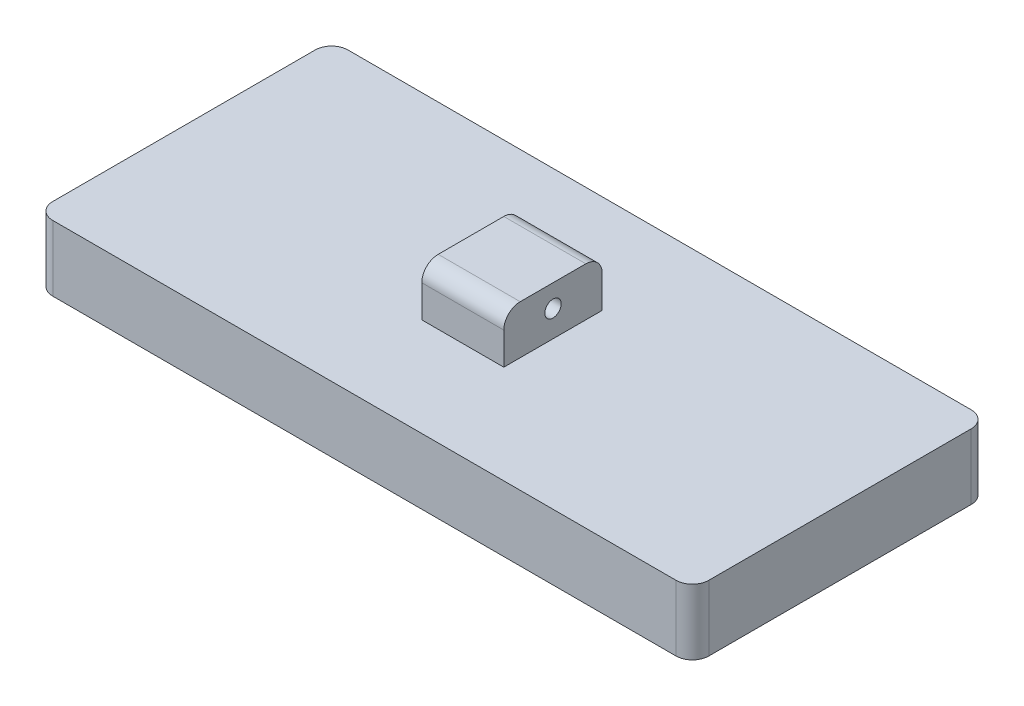
ISO-10303-21;
HEADER;
FILE_DESCRIPTION(('STEP AP214'),'2;1');
FILE_NAME('part.step','',(''),(''),'','','');
FILE_SCHEMA(('AUTOMOTIVE_DESIGN { 1 0 10303 214 1 1 1 1 }'));
ENDSEC;
DATA;
#1=APPLICATION_CONTEXT('core data for automotive mechanical design processes');
#2=APPLICATION_PROTOCOL_DEFINITION('international standard','automotive_design',2000,#1);
#3=PRODUCT_CONTEXT('',#1,'mechanical');
#4=PRODUCT('Part','Part','',(#3));
#5=PRODUCT_RELATED_PRODUCT_CATEGORY('part','',(#4));
#6=PRODUCT_DEFINITION_FORMATION('','',#4);
#7=PRODUCT_DEFINITION_CONTEXT('part definition',#1,'design');
#8=PRODUCT_DEFINITION('design','',#6,#7);
#9=PRODUCT_DEFINITION_SHAPE('','',#8);
#10=(LENGTH_UNIT() NAMED_UNIT(*) SI_UNIT(.MILLI.,.METRE.));
#11=(NAMED_UNIT(*) PLANE_ANGLE_UNIT() SI_UNIT($,.RADIAN.));
#12=(NAMED_UNIT(*) SI_UNIT($,.STERADIAN.) SOLID_ANGLE_UNIT());
#13=UNCERTAINTY_MEASURE_WITH_UNIT(LENGTH_MEASURE(1.E-05),#10,'distance_accuracy_value','');
#14=(GEOMETRIC_REPRESENTATION_CONTEXT(3) GLOBAL_UNCERTAINTY_ASSIGNED_CONTEXT((#13)) GLOBAL_UNIT_ASSIGNED_CONTEXT((#10,
#11,#12)) REPRESENTATION_CONTEXT('',''));
#15=CARTESIAN_POINT('',(0.,0.,0.));
#16=DIRECTION('',(0.,0.,1.));
#17=DIRECTION('',(1.,0.,0.));
#18=AXIS2_PLACEMENT_3D('',#15,#16,#17);
#19=CARTESIAN_POINT('',(0.,20.,0.));
#20=DIRECTION('',(0.,-1.,0.));
#21=DIRECTION('',(0.,0.,-1.));
#22=AXIS2_PLACEMENT_3D('',#19,#20,#21);
#23=PLANE('',#22);
#24=DIRECTION('',(1.,0.,0.));
#25=VECTOR('',#24,1.);
#26=CARTESIAN_POINT('',(0.,20.,0.));
#27=LINE('',#26,#25);
#28=CARTESIAN_POINT('',(5.,20.,0.));
#29=VERTEX_POINT('',#28);
#30=CARTESIAN_POINT('',(195.,20.,0.));
#31=VERTEX_POINT('',#30);
#32=EDGE_CURVE('E292',#29,#31,#27,.T.);
#33=ORIENTED_EDGE('',*,*,#32,.T.);
#34=CARTESIAN_POINT('',(195.,20.,-5.));
#35=DIRECTION('',(0.,-1.,0.));
#36=DIRECTION('',(0.,0.,-1.));
#37=AXIS2_PLACEMENT_3D('',#34,#35,#36);
#38=CIRCLE('',#37,5.);
#39=CARTESIAN_POINT('',(200.,20.,-5.));
#40=VERTEX_POINT('',#39);
#41=EDGE_CURVE('E354',#31,#40,#38,.F.);
#42=ORIENTED_EDGE('',*,*,#41,.T.);
#43=DIRECTION('',(0.,0.,-1.));
#44=VECTOR('',#43,1.);
#45=CARTESIAN_POINT('',(200.,20.,0.));
#46=LINE('',#45,#44);
#47=CARTESIAN_POINT('',(200.,20.,-85.));
#48=VERTEX_POINT('',#47);
#49=EDGE_CURVE('E297',#40,#48,#46,.T.);
#50=ORIENTED_EDGE('',*,*,#49,.T.);
#51=CARTESIAN_POINT('',(195.,20.,-85.));
#52=DIRECTION('',(0.,-1.,0.));
#53=DIRECTION('',(0.,0.,-1.));
#54=AXIS2_PLACEMENT_3D('',#51,#52,#53);
#55=CIRCLE('',#54,5.);
#56=CARTESIAN_POINT('',(195.,20.,-90.));
#57=VERTEX_POINT('',#56);
#58=EDGE_CURVE('E351',#48,#57,#55,.F.);
#59=ORIENTED_EDGE('',*,*,#58,.T.);
#60=DIRECTION('',(-1.,0.,0.));
#61=VECTOR('',#60,1.);
#62=CARTESIAN_POINT('',(0.,20.,-90.));
#63=LINE('',#62,#61);
#64=CARTESIAN_POINT('',(5.,20.,-90.));
#65=VERTEX_POINT('',#64);
#66=EDGE_CURVE('E301',#57,#65,#63,.T.);
#67=ORIENTED_EDGE('',*,*,#66,.T.);
#68=CARTESIAN_POINT('',(5.,20.,-85.));
#69=DIRECTION('',(0.,-1.,0.));
#70=DIRECTION('',(0.,0.,-1.));
#71=AXIS2_PLACEMENT_3D('',#68,#69,#70);
#72=CIRCLE('',#71,5.);
#73=CARTESIAN_POINT('',(0.,20.,-85.));
#74=VERTEX_POINT('',#73);
#75=EDGE_CURVE('E348',#65,#74,#72,.F.);
#76=ORIENTED_EDGE('',*,*,#75,.T.);
#77=DIRECTION('',(0.,0.,1.));
#78=VECTOR('',#77,1.);
#79=CARTESIAN_POINT('',(0.,20.,0.));
#80=LINE('',#79,#78);
#81=CARTESIAN_POINT('',(0.,20.,-5.));
#82=VERTEX_POINT('',#81);
#83=EDGE_CURVE('E288',#74,#82,#80,.T.);
#84=ORIENTED_EDGE('',*,*,#83,.T.);
#85=CARTESIAN_POINT('',(5.,20.,-5.));
#86=DIRECTION('',(0.,-1.,0.));
#87=DIRECTION('',(0.,0.,-1.));
#88=AXIS2_PLACEMENT_3D('',#85,#86,#87);
#89=CIRCLE('',#88,5.);
#90=EDGE_CURVE('E345',#82,#29,#89,.F.);
#91=ORIENTED_EDGE('',*,*,#90,.T.);
#92=EDGE_LOOP('',(#33,#42,#50,#59,#67,#76,#84,#91));
#93=FACE_BOUND('',#92,.T.);
#94=DIRECTION('',(0.,0.,1.));
#95=VECTOR('',#94,1.);
#96=CARTESIAN_POINT('',(87.5,20.,-30.));
#97=LINE('',#96,#95);
#98=CARTESIAN_POINT('',(87.5,20.,-60.));
#99=VERTEX_POINT('',#98);
#100=CARTESIAN_POINT('',(87.5,20.,-30.));
#101=VERTEX_POINT('',#100);
#102=EDGE_CURVE('E240',#99,#101,#97,.T.);
#103=ORIENTED_EDGE('',*,*,#102,.F.);
#104=DIRECTION('',(-1.,0.,0.));
#105=VECTOR('',#104,1.);
#106=CARTESIAN_POINT('',(87.5,20.,-60.));
#107=LINE('',#106,#105);
#108=CARTESIAN_POINT('',(112.5,20.,-60.));
#109=VERTEX_POINT('',#108);
#110=EDGE_CURVE('E257',#109,#99,#107,.T.);
#111=ORIENTED_EDGE('',*,*,#110,.F.);
#112=DIRECTION('',(0.,0.,-1.));
#113=VECTOR('',#112,1.);
#114=CARTESIAN_POINT('',(112.5,20.,-30.));
#115=LINE('',#114,#113);
#116=CARTESIAN_POINT('',(112.5,20.,-30.));
#117=VERTEX_POINT('',#116);
#118=EDGE_CURVE('E269',#117,#109,#115,.T.);
#119=ORIENTED_EDGE('',*,*,#118,.F.);
#120=DIRECTION('',(1.,0.,0.));
#121=VECTOR('',#120,1.);
#122=CARTESIAN_POINT('',(87.5,20.,-30.));
#123=LINE('',#122,#121);
#124=EDGE_CURVE('E265',#101,#117,#123,.T.);
#125=ORIENTED_EDGE('',*,*,#124,.F.);
#126=EDGE_LOOP('',(#103,#111,#119,#125));
#127=FACE_BOUND('',#126,.T.);
#128=ADVANCED_FACE('F39',(#93,#127),#23,.F.);
#129=CARTESIAN_POINT('',(0.,20.,0.));
#130=DIRECTION('',(1.,0.,0.));
#131=DIRECTION('',(0.,0.,-1.));
#132=AXIS2_PLACEMENT_3D('',#129,#130,#131);
#133=PLANE('',#132);
#134=ORIENTED_EDGE('',*,*,#83,.F.);
#135=DIRECTION('',(0.,-1.,0.));
#136=VECTOR('',#135,1.);
#137=CARTESIAN_POINT('',(0.,20.,-85.));
#138=LINE('',#137,#136);
#139=CARTESIAN_POINT('',(0.,0.,-85.));
#140=VERTEX_POINT('',#139);
#141=EDGE_CURVE('E367',#74,#140,#138,.T.);
#142=ORIENTED_EDGE('',*,*,#141,.T.);
#143=DIRECTION('',(0.,0.,1.));
#144=VECTOR('',#143,1.);
#145=CARTESIAN_POINT('',(0.,0.,0.));
#146=LINE('',#145,#144);
#147=CARTESIAN_POINT('',(0.,0.,-5.));
#148=VERTEX_POINT('',#147);
#149=EDGE_CURVE('E287',#140,#148,#146,.T.);
#150=ORIENTED_EDGE('',*,*,#149,.T.);
#151=DIRECTION('',(0.,-1.,0.));
#152=VECTOR('',#151,1.);
#153=CARTESIAN_POINT('',(0.,20.,-5.));
#154=LINE('',#153,#152);
#155=EDGE_CURVE('E364',#148,#82,#154,.F.);
#156=ORIENTED_EDGE('',*,*,#155,.T.);
#157=EDGE_LOOP('',(#134,#142,#150,#156));
#158=FACE_BOUND('',#157,.T.);
#159=ADVANCED_FACE('F425',(#158),#133,.F.);
#160=CARTESIAN_POINT('',(0.,20.,0.));
#161=DIRECTION('',(0.,0.,-1.));
#162=DIRECTION('',(-1.,0.,0.));
#163=AXIS2_PLACEMENT_3D('',#160,#161,#162);
#164=PLANE('',#163);
#165=DIRECTION('',(1.,0.,0.));
#166=VECTOR('',#165,1.);
#167=CARTESIAN_POINT('',(0.,0.,0.));
#168=LINE('',#167,#166);
#169=CARTESIAN_POINT('',(5.,0.,0.));
#170=VERTEX_POINT('',#169);
#171=CARTESIAN_POINT('',(195.,0.,0.));
#172=VERTEX_POINT('',#171);
#173=EDGE_CURVE('E309',#170,#172,#168,.T.);
#174=ORIENTED_EDGE('',*,*,#173,.T.);
#175=DIRECTION('',(0.,-1.,0.));
#176=VECTOR('',#175,1.);
#177=CARTESIAN_POINT('',(195.,20.,0.));
#178=LINE('',#177,#176);
#179=EDGE_CURVE('E342',#172,#31,#178,.F.);
#180=ORIENTED_EDGE('',*,*,#179,.T.);
#181=ORIENTED_EDGE('',*,*,#32,.F.);
#182=DIRECTION('',(0.,-1.,0.));
#183=VECTOR('',#182,1.);
#184=CARTESIAN_POINT('',(5.,20.,0.));
#185=LINE('',#184,#183);
#186=EDGE_CURVE('E338',#29,#170,#185,.T.);
#187=ORIENTED_EDGE('',*,*,#186,.T.);
#188=EDGE_LOOP('',(#174,#180,#181,#187));
#189=FACE_BOUND('',#188,.T.);
#190=ADVANCED_FACE('F431',(#189),#164,.F.);
#191=CARTESIAN_POINT('',(200.,20.,0.));
#192=DIRECTION('',(-1.,0.,0.));
#193=DIRECTION('',(0.,0.,1.));
#194=AXIS2_PLACEMENT_3D('',#191,#192,#193);
#195=PLANE('',#194);
#196=ORIENTED_EDGE('',*,*,#49,.F.);
#197=DIRECTION('',(0.,-1.,0.));
#198=VECTOR('',#197,1.);
#199=CARTESIAN_POINT('',(200.,20.,-5.));
#200=LINE('',#199,#198);
#201=CARTESIAN_POINT('',(200.,0.,-5.));
#202=VERTEX_POINT('',#201);
#203=EDGE_CURVE('E322',#40,#202,#200,.T.);
#204=ORIENTED_EDGE('',*,*,#203,.T.);
#205=DIRECTION('',(0.,0.,-1.));
#206=VECTOR('',#205,1.);
#207=CARTESIAN_POINT('',(200.,0.,0.));
#208=LINE('',#207,#206);
#209=CARTESIAN_POINT('',(200.,0.,-85.));
#210=VERTEX_POINT('',#209);
#211=EDGE_CURVE('E313',#202,#210,#208,.T.);
#212=ORIENTED_EDGE('',*,*,#211,.T.);
#213=DIRECTION('',(0.,-1.,0.));
#214=VECTOR('',#213,1.);
#215=CARTESIAN_POINT('',(200.,20.,-85.));
#216=LINE('',#215,#214);
#217=EDGE_CURVE('E305',#210,#48,#216,.F.);
#218=ORIENTED_EDGE('',*,*,#217,.T.);
#219=EDGE_LOOP('',(#196,#204,#212,#218));
#220=FACE_BOUND('',#219,.T.);
#221=ADVANCED_FACE('F445',(#220),#195,.F.);
#222=CARTESIAN_POINT('',(0.,20.,-90.));
#223=DIRECTION('',(0.,0.,1.));
#224=DIRECTION('',(1.,0.,0.));
#225=AXIS2_PLACEMENT_3D('',#222,#223,#224);
#226=PLANE('',#225);
#227=ORIENTED_EDGE('',*,*,#66,.F.);
#228=DIRECTION('',(0.,-1.,0.));
#229=VECTOR('',#228,1.);
#230=CARTESIAN_POINT('',(195.,20.,-90.));
#231=LINE('',#230,#229);
#232=CARTESIAN_POINT('',(195.,0.,-90.));
#233=VERTEX_POINT('',#232);
#234=EDGE_CURVE('E360',#57,#233,#231,.T.);
#235=ORIENTED_EDGE('',*,*,#234,.T.);
#236=DIRECTION('',(-1.,0.,0.));
#237=VECTOR('',#236,1.);
#238=CARTESIAN_POINT('',(0.,0.,-90.));
#239=LINE('',#238,#237);
#240=CARTESIAN_POINT('',(5.,0.,-90.));
#241=VERTEX_POINT('',#240);
#242=EDGE_CURVE('E293',#233,#241,#239,.T.);
#243=ORIENTED_EDGE('',*,*,#242,.T.);
#244=DIRECTION('',(0.,-1.,0.));
#245=VECTOR('',#244,1.);
#246=CARTESIAN_POINT('',(5.,20.,-90.));
#247=LINE('',#246,#245);
#248=EDGE_CURVE('E357',#241,#65,#247,.F.);
#249=ORIENTED_EDGE('',*,*,#248,.T.);
#250=EDGE_LOOP('',(#227,#235,#243,#249));
#251=FACE_BOUND('',#250,.T.);
#252=ADVANCED_FACE('F441',(#251),#226,.F.);
#253=CARTESIAN_POINT('',(0.,0.,0.));
#254=DIRECTION('',(0.,-1.,0.));
#255=DIRECTION('',(0.,0.,-1.));
#256=AXIS2_PLACEMENT_3D('',#253,#254,#255);
#257=PLANE('',#256);
#258=ORIENTED_EDGE('',*,*,#211,.F.);
#259=CARTESIAN_POINT('',(195.,0.,-5.));
#260=DIRECTION('',(0.,-1.,0.));
#261=DIRECTION('',(0.,0.,-1.));
#262=AXIS2_PLACEMENT_3D('',#259,#260,#261);
#263=CIRCLE('',#262,5.);
#264=EDGE_CURVE('E335',#202,#172,#263,.T.);
#265=ORIENTED_EDGE('',*,*,#264,.T.);
#266=ORIENTED_EDGE('',*,*,#173,.F.);
#267=CARTESIAN_POINT('',(5.,0.,-5.));
#268=DIRECTION('',(0.,-1.,0.));
#269=DIRECTION('',(0.,0.,-1.));
#270=AXIS2_PLACEMENT_3D('',#267,#268,#269);
#271=CIRCLE('',#270,5.);
#272=EDGE_CURVE('E326',#170,#148,#271,.T.);
#273=ORIENTED_EDGE('',*,*,#272,.T.);
#274=ORIENTED_EDGE('',*,*,#149,.F.);
#275=CARTESIAN_POINT('',(5.,0.,-85.));
#276=DIRECTION('',(0.,-1.,0.));
#277=DIRECTION('',(0.,0.,-1.));
#278=AXIS2_PLACEMENT_3D('',#275,#276,#277);
#279=CIRCLE('',#278,5.);
#280=EDGE_CURVE('E329',#140,#241,#279,.T.);
#281=ORIENTED_EDGE('',*,*,#280,.T.);
#282=ORIENTED_EDGE('',*,*,#242,.F.);
#283=CARTESIAN_POINT('',(195.,0.,-85.));
#284=DIRECTION('',(0.,-1.,0.));
#285=DIRECTION('',(0.,0.,-1.));
#286=AXIS2_PLACEMENT_3D('',#283,#284,#285);
#287=CIRCLE('',#286,5.);
#288=EDGE_CURVE('E332',#233,#210,#287,.T.);
#289=ORIENTED_EDGE('',*,*,#288,.T.);
#290=EDGE_LOOP('',(#258,#265,#266,#273,#274,#281,#282,#289));
#291=FACE_BOUND('',#290,.T.);
#292=ADVANCED_FACE('F437',(#291),#257,.T.);
#293=CARTESIAN_POINT('',(195.,20.,-5.));
#294=DIRECTION('',(0.,-1.,0.));
#295=DIRECTION('',(0.,0.,-1.));
#296=AXIS2_PLACEMENT_3D('',#293,#294,#295);
#297=CYLINDRICAL_SURFACE('',#296,5.);
#298=ORIENTED_EDGE('',*,*,#41,.F.);
#299=ORIENTED_EDGE('',*,*,#179,.F.);
#300=ORIENTED_EDGE('',*,*,#264,.F.);
#301=ORIENTED_EDGE('',*,*,#203,.F.);
#302=EDGE_LOOP('',(#298,#299,#300,#301));
#303=FACE_BOUND('',#302,.T.);
#304=ADVANCED_FACE('F440',(#303),#297,.T.);
#305=CARTESIAN_POINT('',(195.,20.,-85.));
#306=DIRECTION('',(0.,-1.,0.));
#307=DIRECTION('',(0.,0.,-1.));
#308=AXIS2_PLACEMENT_3D('',#305,#306,#307);
#309=CYLINDRICAL_SURFACE('',#308,5.);
#310=ORIENTED_EDGE('',*,*,#58,.F.);
#311=ORIENTED_EDGE('',*,*,#217,.F.);
#312=ORIENTED_EDGE('',*,*,#288,.F.);
#313=ORIENTED_EDGE('',*,*,#234,.F.);
#314=EDGE_LOOP('',(#310,#311,#312,#313));
#315=FACE_BOUND('',#314,.T.);
#316=ADVANCED_FACE('F455',(#315),#309,.T.);
#317=CARTESIAN_POINT('',(5.,20.,-85.));
#318=DIRECTION('',(0.,-1.,0.));
#319=DIRECTION('',(0.,0.,-1.));
#320=AXIS2_PLACEMENT_3D('',#317,#318,#319);
#321=CYLINDRICAL_SURFACE('',#320,5.);
#322=ORIENTED_EDGE('',*,*,#75,.F.);
#323=ORIENTED_EDGE('',*,*,#248,.F.);
#324=ORIENTED_EDGE('',*,*,#280,.F.);
#325=ORIENTED_EDGE('',*,*,#141,.F.);
#326=EDGE_LOOP('',(#322,#323,#324,#325));
#327=FACE_BOUND('',#326,.T.);
#328=ADVANCED_FACE('F459',(#327),#321,.T.);
#329=CARTESIAN_POINT('',(5.,20.,-5.));
#330=DIRECTION('',(0.,-1.,0.));
#331=DIRECTION('',(0.,0.,-1.));
#332=AXIS2_PLACEMENT_3D('',#329,#330,#331);
#333=CYLINDRICAL_SURFACE('',#332,5.);
#334=ORIENTED_EDGE('',*,*,#90,.F.);
#335=ORIENTED_EDGE('',*,*,#155,.F.);
#336=ORIENTED_EDGE('',*,*,#272,.F.);
#337=ORIENTED_EDGE('',*,*,#186,.F.);
#338=EDGE_LOOP('',(#334,#335,#336,#337));
#339=FACE_BOUND('',#338,.T.);
#340=ADVANCED_FACE('F463',(#339),#333,.T.);
#341=CARTESIAN_POINT('',(87.5,34.8,-30.));
#342=DIRECTION('',(1.,0.,0.));
#343=DIRECTION('',(0.,0.,-1.));
#344=AXIS2_PLACEMENT_3D('',#341,#342,#343);
#345=PLANE('',#344);
#346=DIRECTION('',(0.,-0.866025403784439,0.5));
#347=VECTOR('',#346,1.);
#348=CARTESIAN_POINT('',(87.5,28.,-49.561067126598));
#349=LINE('',#348,#347);
#350=CARTESIAN_POINT('',(87.5,28.,-49.561067126598));
#351=VERTEX_POINT('',#350);
#352=CARTESIAN_POINT('',(87.5,24.05,-47.280533563299));
#353=VERTEX_POINT('',#352);
#354=EDGE_CURVE('E223',#351,#353,#349,.T.);
#355=ORIENTED_EDGE('',*,*,#354,.F.);
#356=DIRECTION('',(0.,-0.866025403784439,-0.5));
#357=VECTOR('',#356,1.);
#358=CARTESIAN_POINT('',(87.5,31.95,-47.280533563299));
#359=LINE('',#358,#357);
#360=CARTESIAN_POINT('',(87.5,31.95,-47.280533563299));
#361=VERTEX_POINT('',#360);
#362=EDGE_CURVE('E55',#361,#351,#359,.T.);
#363=ORIENTED_EDGE('',*,*,#362,.F.);
#364=DIRECTION('',(0.,0.,-1.));
#365=VECTOR('',#364,1.);
#366=CARTESIAN_POINT('',(87.5,31.95,-42.719466436701));
#367=LINE('',#366,#365);
#368=CARTESIAN_POINT('',(87.5,31.95,-42.719466436701));
#369=VERTEX_POINT('',#368);
#370=EDGE_CURVE('E200',#369,#361,#367,.T.);
#371=ORIENTED_EDGE('',*,*,#370,.F.);
#372=DIRECTION('',(0.,0.866025403784439,-0.5));
#373=VECTOR('',#372,1.);
#374=CARTESIAN_POINT('',(87.5,28.,-40.4389328734019));
#375=LINE('',#374,#373);
#376=CARTESIAN_POINT('',(87.5,28.,-40.4389328734019));
#377=VERTEX_POINT('',#376);
#378=EDGE_CURVE('E204',#377,#369,#375,.T.);
#379=ORIENTED_EDGE('',*,*,#378,.F.);
#380=DIRECTION('',(0.,0.866025403784439,0.499999999999999));
#381=VECTOR('',#380,1.);
#382=CARTESIAN_POINT('',(87.5,24.05,-42.719466436701));
#383=LINE('',#382,#381);
#384=CARTESIAN_POINT('',(87.5,24.05,-42.719466436701));
#385=VERTEX_POINT('',#384);
#386=EDGE_CURVE('E230',#385,#377,#383,.T.);
#387=ORIENTED_EDGE('',*,*,#386,.F.);
#388=DIRECTION('',(0.,0.,1.));
#389=VECTOR('',#388,1.);
#390=CARTESIAN_POINT('',(87.5,24.05,-47.280533563299));
#391=LINE('',#390,#389);
#392=EDGE_CURVE('E226',#353,#385,#391,.T.);
#393=ORIENTED_EDGE('',*,*,#392,.F.);
#394=EDGE_LOOP('',(#355,#363,#371,#379,#387,#393));
#395=FACE_BOUND('',#394,.T.);
#396=DIRECTION('',(0.,0.,1.));
#397=VECTOR('',#396,1.);
#398=CARTESIAN_POINT('',(87.5,34.8,-30.));
#399=LINE('',#398,#397);
#400=CARTESIAN_POINT('',(87.5,34.8,-55.));
#401=VERTEX_POINT('',#400);
#402=CARTESIAN_POINT('',(87.5,34.8,-35.));
#403=VERTEX_POINT('',#402);
#404=EDGE_CURVE('E252',#401,#403,#399,.T.);
#405=ORIENTED_EDGE('',*,*,#404,.F.);
#406=CARTESIAN_POINT('',(87.5,29.8,-55.));
#407=DIRECTION('',(1.,0.,0.));
#408=DIRECTION('',(0.,0.,-1.));
#409=AXIS2_PLACEMENT_3D('',#406,#407,#408);
#410=CIRCLE('',#409,5.);
#411=CARTESIAN_POINT('',(87.5,29.8,-60.));
#412=VERTEX_POINT('',#411);
#413=EDGE_CURVE('E382',#401,#412,#410,.F.);
#414=ORIENTED_EDGE('',*,*,#413,.T.);
#415=DIRECTION('',(0.,-1.,0.));
#416=VECTOR('',#415,1.);
#417=CARTESIAN_POINT('',(87.5,34.8,-60.));
#418=LINE('',#417,#416);
#419=EDGE_CURVE('E261',#412,#99,#418,.T.);
#420=ORIENTED_EDGE('',*,*,#419,.T.);
#421=ORIENTED_EDGE('',*,*,#102,.T.);
#422=DIRECTION('',(0.,-1.,0.));
#423=VECTOR('',#422,1.);
#424=CARTESIAN_POINT('',(87.5,34.8,-30.));
#425=LINE('',#424,#423);
#426=CARTESIAN_POINT('',(87.5,29.8,-30.));
#427=VERTEX_POINT('',#426);
#428=EDGE_CURVE('E284',#427,#101,#425,.T.);
#429=ORIENTED_EDGE('',*,*,#428,.F.);
#430=CARTESIAN_POINT('',(87.5,29.8,-35.));
#431=DIRECTION('',(1.,0.,0.));
#432=DIRECTION('',(0.,0.,-1.));
#433=AXIS2_PLACEMENT_3D('',#430,#431,#432);
#434=CIRCLE('',#433,5.);
#435=EDGE_CURVE('E379',#427,#403,#434,.F.);
#436=ORIENTED_EDGE('',*,*,#435,.T.);
#437=EDGE_LOOP('',(#405,#414,#420,#421,#429,#436));
#438=FACE_BOUND('',#437,.T.);
#439=ADVANCED_FACE('F403',(#395,#438),#345,.F.);
#440=CARTESIAN_POINT('',(87.5,34.8,-30.));
#441=DIRECTION('',(0.,0.,-1.));
#442=DIRECTION('',(-1.,0.,0.));
#443=AXIS2_PLACEMENT_3D('',#440,#441,#442);
#444=PLANE('',#443);
#445=DIRECTION('',(0.,-1.,0.));
#446=VECTOR('',#445,1.);
#447=CARTESIAN_POINT('',(112.5,34.8,-30.));
#448=LINE('',#447,#446);
#449=CARTESIAN_POINT('',(112.5,29.8,-30.));
#450=VERTEX_POINT('',#449);
#451=EDGE_CURVE('E281',#450,#117,#448,.T.);
#452=ORIENTED_EDGE('',*,*,#451,.F.);
#453=DIRECTION('',(1.,0.,0.));
#454=VECTOR('',#453,1.);
#455=CARTESIAN_POINT('',(87.5,29.8,-30.));
#456=LINE('',#455,#454);
#457=EDGE_CURVE('E11',#450,#427,#456,.F.);
#458=ORIENTED_EDGE('',*,*,#457,.T.);
#459=ORIENTED_EDGE('',*,*,#428,.T.);
#460=ORIENTED_EDGE('',*,*,#124,.T.);
#461=EDGE_LOOP('',(#452,#458,#459,#460));
#462=FACE_BOUND('',#461,.T.);
#463=ADVANCED_FACE('F413',(#462),#444,.F.);
#464=CARTESIAN_POINT('',(112.5,34.8,-30.));
#465=DIRECTION('',(-1.,0.,0.));
#466=DIRECTION('',(0.,0.,1.));
#467=AXIS2_PLACEMENT_3D('',#464,#465,#466);
#468=PLANE('',#467);
#469=CARTESIAN_POINT('',(112.5,28.,-45.));
#470=DIRECTION('',(-1.,0.,0.));
#471=DIRECTION('',(0.,0.,1.));
#472=AXIS2_PLACEMENT_3D('',#469,#470,#471);
#473=CIRCLE('',#472,2.5);
#474=CARTESIAN_POINT('',(112.5,28.,-42.5));
#475=VERTEX_POINT('',#474);
#476=EDGE_CURVE('E207',#475,#475,#473,.F.);
#477=ORIENTED_EDGE('',*,*,#476,.F.);
#478=EDGE_LOOP('',(#477));
#479=FACE_BOUND('',#478,.T.);
#480=DIRECTION('',(0.,-1.,0.));
#481=VECTOR('',#480,1.);
#482=CARTESIAN_POINT('',(112.5,34.8,-60.));
#483=LINE('',#482,#481);
#484=CARTESIAN_POINT('',(112.5,29.8,-60.));
#485=VERTEX_POINT('',#484);
#486=EDGE_CURVE('E278',#485,#109,#483,.T.);
#487=ORIENTED_EDGE('',*,*,#486,.F.);
#488=CARTESIAN_POINT('',(112.5,29.8,-55.));
#489=DIRECTION('',(-1.,0.,0.));
#490=DIRECTION('',(0.,0.,1.));
#491=AXIS2_PLACEMENT_3D('',#488,#489,#490);
#492=CIRCLE('',#491,5.);
#493=CARTESIAN_POINT('',(112.5,34.8,-55.));
#494=VERTEX_POINT('',#493);
#495=EDGE_CURVE('E48',#485,#494,#492,.F.);
#496=ORIENTED_EDGE('',*,*,#495,.T.);
#497=DIRECTION('',(0.,0.,-1.));
#498=VECTOR('',#497,1.);
#499=CARTESIAN_POINT('',(112.5,34.8,-30.));
#500=LINE('',#499,#498);
#501=CARTESIAN_POINT('',(112.5,34.8,-35.));
#502=VERTEX_POINT('',#501);
#503=EDGE_CURVE('E256',#502,#494,#500,.T.);
#504=ORIENTED_EDGE('',*,*,#503,.F.);
#505=CARTESIAN_POINT('',(112.5,29.8,-35.));
#506=DIRECTION('',(-1.,0.,0.));
#507=DIRECTION('',(0.,0.,1.));
#508=AXIS2_PLACEMENT_3D('',#505,#506,#507);
#509=CIRCLE('',#508,5.);
#510=EDGE_CURVE('E63',#502,#450,#509,.F.);
#511=ORIENTED_EDGE('',*,*,#510,.T.);
#512=ORIENTED_EDGE('',*,*,#451,.T.);
#513=ORIENTED_EDGE('',*,*,#118,.T.);
#514=EDGE_LOOP('',(#487,#496,#504,#511,#512,#513));
#515=FACE_BOUND('',#514,.T.);
#516=ADVANCED_FACE('F392',(#479,#515),#468,.F.);
#517=CARTESIAN_POINT('',(87.5,34.8,-60.));
#518=DIRECTION('',(0.,0.,1.));
#519=DIRECTION('',(1.,0.,0.));
#520=AXIS2_PLACEMENT_3D('',#517,#518,#519);
#521=PLANE('',#520);
#522=ORIENTED_EDGE('',*,*,#419,.F.);
#523=DIRECTION('',(-1.,0.,0.));
#524=VECTOR('',#523,1.);
#525=CARTESIAN_POINT('',(87.5,29.8,-60.));
#526=LINE('',#525,#524);
#527=EDGE_CURVE('E385',#412,#485,#526,.F.);
#528=ORIENTED_EDGE('',*,*,#527,.T.);
#529=ORIENTED_EDGE('',*,*,#486,.T.);
#530=ORIENTED_EDGE('',*,*,#110,.T.);
#531=EDGE_LOOP('',(#522,#528,#529,#530));
#532=FACE_BOUND('',#531,.T.);
#533=ADVANCED_FACE('F406',(#532),#521,.F.);
#534=CARTESIAN_POINT('',(0.,34.8,0.));
#535=DIRECTION('',(0.,-1.,0.));
#536=DIRECTION('',(0.,0.,-1.));
#537=AXIS2_PLACEMENT_3D('',#534,#535,#536);
#538=PLANE('',#537);
#539=ORIENTED_EDGE('',*,*,#503,.T.);
#540=DIRECTION('',(-1.,0.,0.));
#541=VECTOR('',#540,1.);
#542=CARTESIAN_POINT('',(0.,34.8,-55.));
#543=LINE('',#542,#541);
#544=EDGE_CURVE('E375',#494,#401,#543,.T.);
#545=ORIENTED_EDGE('',*,*,#544,.T.);
#546=ORIENTED_EDGE('',*,*,#404,.T.);
#547=DIRECTION('',(1.,0.,0.));
#548=VECTOR('',#547,1.);
#549=CARTESIAN_POINT('',(0.,34.8,-35.));
#550=LINE('',#549,#548);
#551=EDGE_CURVE('E371',#403,#502,#550,.T.);
#552=ORIENTED_EDGE('',*,*,#551,.T.);
#553=EDGE_LOOP('',(#539,#545,#546,#552));
#554=FACE_BOUND('',#553,.T.);
#555=ADVANCED_FACE('F397',(#554),#538,.F.);
#556=CARTESIAN_POINT('',(0.,29.8,-55.));
#557=DIRECTION('',(-1.,0.,0.));
#558=DIRECTION('',(0.,0.,1.));
#559=AXIS2_PLACEMENT_3D('',#556,#557,#558);
#560=CYLINDRICAL_SURFACE('',#559,5.);
#561=ORIENTED_EDGE('',*,*,#495,.F.);
#562=ORIENTED_EDGE('',*,*,#527,.F.);
#563=ORIENTED_EDGE('',*,*,#413,.F.);
#564=ORIENTED_EDGE('',*,*,#544,.F.);
#565=EDGE_LOOP('',(#561,#562,#563,#564));
#566=FACE_BOUND('',#565,.T.);
#567=ADVANCED_FACE('F400',(#566),#560,.T.);
#568=CARTESIAN_POINT('',(0.,29.8,-35.));
#569=DIRECTION('',(1.,0.,0.));
#570=DIRECTION('',(0.,0.,-1.));
#571=AXIS2_PLACEMENT_3D('',#568,#569,#570);
#572=CYLINDRICAL_SURFACE('',#571,5.);
#573=ORIENTED_EDGE('',*,*,#435,.F.);
#574=ORIENTED_EDGE('',*,*,#457,.F.);
#575=ORIENTED_EDGE('',*,*,#510,.F.);
#576=ORIENTED_EDGE('',*,*,#551,.F.);
#577=EDGE_LOOP('',(#573,#574,#575,#576));
#578=FACE_BOUND('',#577,.T.);
#579=ADVANCED_FACE('F41',(#578),#572,.T.);
#580=CARTESIAN_POINT('',(97.5,31.95,-47.280533563299));
#581=DIRECTION('',(0.,0.5,-0.866025403784439));
#582=DIRECTION('',(0.,0.866025403784439,0.5));
#583=AXIS2_PLACEMENT_3D('',#580,#581,#582);
#584=PLANE('',#583);
#585=ORIENTED_EDGE('',*,*,#362,.T.);
#586=DIRECTION('',(-1.,0.,0.));
#587=VECTOR('',#586,1.);
#588=CARTESIAN_POINT('',(97.5,28.,-49.561067126598));
#589=LINE('',#588,#587);
#590=CARTESIAN_POINT('',(97.5,28.,-49.561067126598));
#591=VERTEX_POINT('',#590);
#592=EDGE_CURVE('E174',#591,#351,#589,.T.);
#593=ORIENTED_EDGE('',*,*,#592,.F.);
#594=DIRECTION('',(0.,-0.866025403784439,-0.5));
#595=VECTOR('',#594,1.);
#596=CARTESIAN_POINT('',(97.5,31.95,-47.280533563299));
#597=LINE('',#596,#595);
#598=CARTESIAN_POINT('',(97.5,31.95,-47.280533563299));
#599=VERTEX_POINT('',#598);
#600=EDGE_CURVE('E178',#599,#591,#597,.T.);
#601=ORIENTED_EDGE('',*,*,#600,.F.);
#602=DIRECTION('',(-1.,0.,0.));
#603=VECTOR('',#602,1.);
#604=CARTESIAN_POINT('',(97.5,31.95,-47.280533563299));
#605=LINE('',#604,#603);
#606=EDGE_CURVE('E237',#599,#361,#605,.T.);
#607=ORIENTED_EDGE('',*,*,#606,.T.);
#608=EDGE_LOOP('',(#585,#593,#601,#607));
#609=FACE_BOUND('',#608,.T.);
#610=ADVANCED_FACE('F176',(#609),#584,.F.);
#611=CARTESIAN_POINT('',(97.5,31.95,-42.719466436701));
#612=DIRECTION('',(0.,1.,0.));
#613=DIRECTION('',(0.,0.,1.));
#614=AXIS2_PLACEMENT_3D('',#611,#612,#613);
#615=PLANE('',#614);
#616=ORIENTED_EDGE('',*,*,#370,.T.);
#617=ORIENTED_EDGE('',*,*,#606,.F.);
#618=DIRECTION('',(0.,0.,-1.));
#619=VECTOR('',#618,1.);
#620=CARTESIAN_POINT('',(97.5,31.95,-42.719466436701));
#621=LINE('',#620,#619);
#622=CARTESIAN_POINT('',(97.5,31.95,-42.719466436701));
#623=VERTEX_POINT('',#622);
#624=EDGE_CURVE('E185',#623,#599,#621,.T.);
#625=ORIENTED_EDGE('',*,*,#624,.F.);
#626=DIRECTION('',(-1.,0.,0.));
#627=VECTOR('',#626,1.);
#628=CARTESIAN_POINT('',(97.5,31.95,-42.719466436701));
#629=LINE('',#628,#627);
#630=EDGE_CURVE('E241',#623,#369,#629,.T.);
#631=ORIENTED_EDGE('',*,*,#630,.T.);
#632=EDGE_LOOP('',(#616,#617,#625,#631));
#633=FACE_BOUND('',#632,.T.);
#634=ADVANCED_FACE('F422',(#633),#615,.F.);
#635=CARTESIAN_POINT('',(97.5,28.,-40.4389328734019));
#636=DIRECTION('',(0.,0.5,0.866025403784439));
#637=DIRECTION('',(0.,-0.866025403784439,0.5));
#638=AXIS2_PLACEMENT_3D('',#635,#636,#637);
#639=PLANE('',#638);
#640=ORIENTED_EDGE('',*,*,#378,.T.);
#641=ORIENTED_EDGE('',*,*,#630,.F.);
#642=DIRECTION('',(0.,0.866025403784439,-0.5));
#643=VECTOR('',#642,1.);
#644=CARTESIAN_POINT('',(97.5,28.,-40.4389328734019));
#645=LINE('',#644,#643);
#646=CARTESIAN_POINT('',(97.5,28.,-40.4389328734019));
#647=VERTEX_POINT('',#646);
#648=EDGE_CURVE('E216',#647,#623,#645,.T.);
#649=ORIENTED_EDGE('',*,*,#648,.F.);
#650=DIRECTION('',(-1.,0.,0.));
#651=VECTOR('',#650,1.);
#652=CARTESIAN_POINT('',(97.5,28.,-40.4389328734019));
#653=LINE('',#652,#651);
#654=EDGE_CURVE('E244',#647,#377,#653,.T.);
#655=ORIENTED_EDGE('',*,*,#654,.T.);
#656=EDGE_LOOP('',(#640,#641,#649,#655));
#657=FACE_BOUND('',#656,.T.);
#658=ADVANCED_FACE('F505',(#657),#639,.F.);
#659=CARTESIAN_POINT('',(97.5,24.05,-42.719466436701));
#660=DIRECTION('',(0.,-0.499999999999999,0.866025403784439));
#661=DIRECTION('',(0.,-0.866025403784439,-0.499999999999999));
#662=AXIS2_PLACEMENT_3D('',#659,#660,#661);
#663=PLANE('',#662);
#664=ORIENTED_EDGE('',*,*,#386,.T.);
#665=ORIENTED_EDGE('',*,*,#654,.F.);
#666=DIRECTION('',(0.,0.866025403784439,0.499999999999999));
#667=VECTOR('',#666,1.);
#668=CARTESIAN_POINT('',(97.5,24.05,-42.719466436701));
#669=LINE('',#668,#667);
#670=CARTESIAN_POINT('',(97.5,24.05,-42.719466436701));
#671=VERTEX_POINT('',#670);
#672=EDGE_CURVE('E212',#671,#647,#669,.T.);
#673=ORIENTED_EDGE('',*,*,#672,.F.);
#674=DIRECTION('',(-1.,0.,0.));
#675=VECTOR('',#674,1.);
#676=CARTESIAN_POINT('',(97.5,24.05,-42.719466436701));
#677=LINE('',#676,#675);
#678=EDGE_CURVE('E247',#671,#385,#677,.T.);
#679=ORIENTED_EDGE('',*,*,#678,.T.);
#680=EDGE_LOOP('',(#664,#665,#673,#679));
#681=FACE_BOUND('',#680,.T.);
#682=ADVANCED_FACE('F503',(#681),#663,.F.);
#683=CARTESIAN_POINT('',(97.5,24.05,-47.280533563299));
#684=DIRECTION('',(0.,-1.,0.));
#685=DIRECTION('',(0.,0.,-1.));
#686=AXIS2_PLACEMENT_3D('',#683,#684,#685);
#687=PLANE('',#686);
#688=ORIENTED_EDGE('',*,*,#392,.T.);
#689=ORIENTED_EDGE('',*,*,#678,.F.);
#690=DIRECTION('',(0.,0.,1.));
#691=VECTOR('',#690,1.);
#692=CARTESIAN_POINT('',(97.5,24.05,-47.280533563299));
#693=LINE('',#692,#691);
#694=CARTESIAN_POINT('',(97.5,24.05,-47.280533563299));
#695=VERTEX_POINT('',#694);
#696=EDGE_CURVE('E194',#695,#671,#693,.T.);
#697=ORIENTED_EDGE('',*,*,#696,.F.);
#698=DIRECTION('',(-1.,0.,0.));
#699=VECTOR('',#698,1.);
#700=CARTESIAN_POINT('',(97.5,24.05,-47.280533563299));
#701=LINE('',#700,#699);
#702=EDGE_CURVE('E184',#695,#353,#701,.T.);
#703=ORIENTED_EDGE('',*,*,#702,.T.);
#704=EDGE_LOOP('',(#688,#689,#697,#703));
#705=FACE_BOUND('',#704,.T.);
#706=ADVANCED_FACE('F499',(#705),#687,.F.);
#707=CARTESIAN_POINT('',(97.5,28.,-49.561067126598));
#708=DIRECTION('',(0.,-0.5,-0.866025403784439));
#709=DIRECTION('',(0.,0.866025403784439,-0.5));
#710=AXIS2_PLACEMENT_3D('',#707,#708,#709);
#711=PLANE('',#710);
#712=ORIENTED_EDGE('',*,*,#354,.T.);
#713=ORIENTED_EDGE('',*,*,#702,.F.);
#714=DIRECTION('',(0.,-0.866025403784439,0.5));
#715=VECTOR('',#714,1.);
#716=CARTESIAN_POINT('',(97.5,28.,-49.561067126598));
#717=LINE('',#716,#715);
#718=EDGE_CURVE('E188',#591,#695,#717,.T.);
#719=ORIENTED_EDGE('',*,*,#718,.F.);
#720=ORIENTED_EDGE('',*,*,#592,.T.);
#721=EDGE_LOOP('',(#712,#713,#719,#720));
#722=FACE_BOUND('',#721,.T.);
#723=ADVANCED_FACE('F189',(#722),#711,.F.);
#724=CARTESIAN_POINT('',(97.5,0.,0.));
#725=DIRECTION('',(-1.,0.,0.));
#726=DIRECTION('',(0.,0.,1.));
#727=AXIS2_PLACEMENT_3D('',#724,#725,#726);
#728=PLANE('',#727);
#729=CARTESIAN_POINT('',(97.5,28.,-45.));
#730=DIRECTION('',(-1.,0.,0.));
#731=DIRECTION('',(0.,0.,1.));
#732=AXIS2_PLACEMENT_3D('',#729,#730,#731);
#733=CIRCLE('',#732,2.5);
#734=CARTESIAN_POINT('',(97.5,28.,-42.5));
#735=VERTEX_POINT('',#734);
#736=EDGE_CURVE('E534',#735,#735,#733,.F.);
#737=ORIENTED_EDGE('',*,*,#736,.T.);
#738=EDGE_LOOP('',(#737));
#739=FACE_BOUND('',#738,.T.);
#740=ORIENTED_EDGE('',*,*,#600,.T.);
#741=ORIENTED_EDGE('',*,*,#718,.T.);
#742=ORIENTED_EDGE('',*,*,#696,.T.);
#743=ORIENTED_EDGE('',*,*,#672,.T.);
#744=ORIENTED_EDGE('',*,*,#648,.T.);
#745=ORIENTED_EDGE('',*,*,#624,.T.);
#746=EDGE_LOOP('',(#740,#741,#742,#743,#744,#745));
#747=FACE_BOUND('',#746,.T.);
#748=ADVANCED_FACE('F196',(#739,#747),#728,.T.);
#749=CARTESIAN_POINT('',(200.001,28.,-45.));
#750=DIRECTION('',(-1.,0.,0.));
#751=DIRECTION('',(0.,0.,1.));
#752=AXIS2_PLACEMENT_3D('',#749,#750,#751);
#753=CYLINDRICAL_SURFACE('',#752,2.5);
#754=ORIENTED_EDGE('',*,*,#736,.F.);
#755=EDGE_LOOP('',(#754));
#756=FACE_BOUND('',#755,.T.);
#757=ORIENTED_EDGE('',*,*,#476,.T.);
#758=EDGE_LOOP('',(#757));
#759=FACE_BOUND('',#758,.T.);
#760=ADVANCED_FACE('F540',(#756,#759),#753,.F.);
#761=CLOSED_SHELL('',(#128,#159,#190,#221,#252,#292,#304,#316,#328,#340,#439,#463,#516,#533,
#555,#567,#579,#610,#634,#658,#682,#706,#723,#748,#760));
#762=MANIFOLD_SOLID_BREP('B2',#761);
#763=ADVANCED_BREP_SHAPE_REPRESENTATION('',(#18,#762),#14);
#764=SHAPE_DEFINITION_REPRESENTATION(#9,#763);
ENDSEC;
END-ISO-10303-21;
